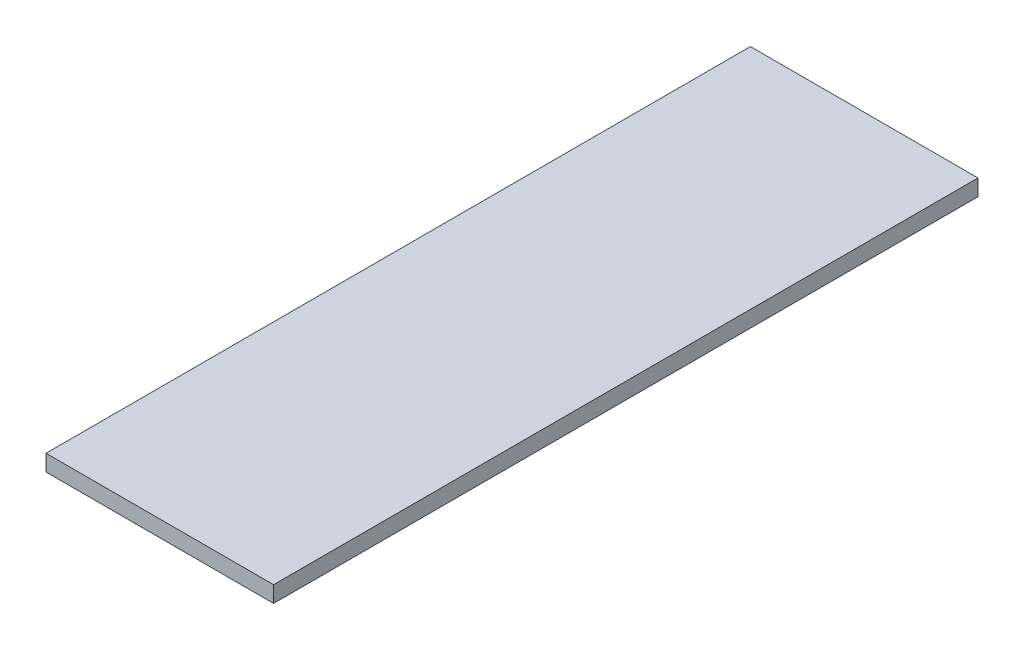
ISO-10303-21;
HEADER;
FILE_DESCRIPTION(('STEP AP214'),'2;1');
FILE_NAME('part.step','',(''),(''),'','','');
FILE_SCHEMA(('AUTOMOTIVE_DESIGN { 1 0 10303 214 1 1 1 1 }'));
ENDSEC;
DATA;
#1=APPLICATION_CONTEXT('core data for automotive mechanical design processes');
#2=APPLICATION_PROTOCOL_DEFINITION('international standard','automotive_design',2000,#1);
#3=PRODUCT_CONTEXT('',#1,'mechanical');
#4=PRODUCT('Part','Part','',(#3));
#5=PRODUCT_RELATED_PRODUCT_CATEGORY('part','',(#4));
#6=PRODUCT_DEFINITION_FORMATION('','',#4);
#7=PRODUCT_DEFINITION_CONTEXT('part definition',#1,'design');
#8=PRODUCT_DEFINITION('design','',#6,#7);
#9=PRODUCT_DEFINITION_SHAPE('','',#8);
#10=(LENGTH_UNIT() NAMED_UNIT(*) SI_UNIT(.MILLI.,.METRE.));
#11=(NAMED_UNIT(*) PLANE_ANGLE_UNIT() SI_UNIT($,.RADIAN.));
#12=(NAMED_UNIT(*) SI_UNIT($,.STERADIAN.) SOLID_ANGLE_UNIT());
#13=UNCERTAINTY_MEASURE_WITH_UNIT(LENGTH_MEASURE(1.E-05),#10,'distance_accuracy_value','');
#14=(GEOMETRIC_REPRESENTATION_CONTEXT(3) GLOBAL_UNCERTAINTY_ASSIGNED_CONTEXT((#13)) GLOBAL_UNIT_ASSIGNED_CONTEXT((#10,
#11,#12)) REPRESENTATION_CONTEXT('',''));
#15=CARTESIAN_POINT('',(0.,0.,0.));
#16=DIRECTION('',(0.,0.,1.));
#17=DIRECTION('',(1.,0.,0.));
#18=AXIS2_PLACEMENT_3D('',#15,#16,#17);
#19=CARTESIAN_POINT('',(10.5,1.5,32.5));
#20=DIRECTION('',(-1.,0.,0.));
#21=DIRECTION('',(0.,0.,1.));
#22=AXIS2_PLACEMENT_3D('',#19,#20,#21);
#23=PLANE('',#22);
#24=DIRECTION('',(0.,0.,-1.));
#25=VECTOR('',#24,1.);
#26=CARTESIAN_POINT('',(10.5,0.,32.5));
#27=LINE('',#26,#25);
#28=CARTESIAN_POINT('',(10.5,0.,32.5));
#29=VERTEX_POINT('',#28);
#30=CARTESIAN_POINT('',(10.5,0.,-32.5));
#31=VERTEX_POINT('',#30);
#32=EDGE_CURVE('E109',#29,#31,#27,.T.);
#33=ORIENTED_EDGE('',*,*,#32,.T.);
#34=DIRECTION('',(0.,-1.,0.));
#35=VECTOR('',#34,1.);
#36=CARTESIAN_POINT('',(10.5,1.5,-32.5));
#37=LINE('',#36,#35);
#38=CARTESIAN_POINT('',(10.5,1.5,-32.5));
#39=VERTEX_POINT('',#38);
#40=EDGE_CURVE('E11',#39,#31,#37,.T.);
#41=ORIENTED_EDGE('',*,*,#40,.F.);
#42=DIRECTION('',(0.,0.,-1.));
#43=VECTOR('',#42,1.);
#44=CARTESIAN_POINT('',(10.5,1.5,32.5));
#45=LINE('',#44,#43);
#46=CARTESIAN_POINT('',(10.5,1.5,32.5));
#47=VERTEX_POINT('',#46);
#48=EDGE_CURVE('E93',#47,#39,#45,.T.);
#49=ORIENTED_EDGE('',*,*,#48,.F.);
#50=DIRECTION('',(0.,-1.,0.));
#51=VECTOR('',#50,1.);
#52=CARTESIAN_POINT('',(10.5,1.5,32.5));
#53=LINE('',#52,#51);
#54=EDGE_CURVE('E105',#47,#29,#53,.T.);
#55=ORIENTED_EDGE('',*,*,#54,.T.);
#56=EDGE_LOOP('',(#33,#41,#49,#55));
#57=FACE_BOUND('',#56,.T.);
#58=ADVANCED_FACE('F41',(#57),#23,.F.);
#59=CARTESIAN_POINT('',(-10.5,1.5,-32.5));
#60=DIRECTION('',(0.,0.,1.));
#61=DIRECTION('',(1.,0.,0.));
#62=AXIS2_PLACEMENT_3D('',#59,#60,#61);
#63=PLANE('',#62);
#64=DIRECTION('',(-1.,0.,0.));
#65=VECTOR('',#64,1.);
#66=CARTESIAN_POINT('',(-10.5,0.,-32.5));
#67=LINE('',#66,#65);
#68=CARTESIAN_POINT('',(-10.5,0.,-32.5));
#69=VERTEX_POINT('',#68);
#70=EDGE_CURVE('E98',#31,#69,#67,.T.);
#71=ORIENTED_EDGE('',*,*,#70,.T.);
#72=DIRECTION('',(0.,-1.,0.));
#73=VECTOR('',#72,1.);
#74=CARTESIAN_POINT('',(-10.5,1.5,-32.5));
#75=LINE('',#74,#73);
#76=CARTESIAN_POINT('',(-10.5,1.5,-32.5));
#77=VERTEX_POINT('',#76);
#78=EDGE_CURVE('E50',#77,#69,#75,.T.);
#79=ORIENTED_EDGE('',*,*,#78,.F.);
#80=DIRECTION('',(-1.,0.,0.));
#81=VECTOR('',#80,1.);
#82=CARTESIAN_POINT('',(-10.5,1.5,-32.5));
#83=LINE('',#82,#81);
#84=EDGE_CURVE('E88',#39,#77,#83,.T.);
#85=ORIENTED_EDGE('',*,*,#84,.F.);
#86=ORIENTED_EDGE('',*,*,#40,.T.);
#87=EDGE_LOOP('',(#71,#79,#85,#86));
#88=FACE_BOUND('',#87,.T.);
#89=ADVANCED_FACE('F97',(#88),#63,.F.);
#90=CARTESIAN_POINT('',(-10.5,1.5,32.5));
#91=DIRECTION('',(1.,0.,0.));
#92=DIRECTION('',(0.,0.,-1.));
#93=AXIS2_PLACEMENT_3D('',#90,#91,#92);
#94=PLANE('',#93);
#95=DIRECTION('',(0.,0.,1.));
#96=VECTOR('',#95,1.);
#97=CARTESIAN_POINT('',(-10.5,0.,32.5));
#98=LINE('',#97,#96);
#99=CARTESIAN_POINT('',(-10.5,0.,32.5));
#100=VERTEX_POINT('',#99);
#101=EDGE_CURVE('E75',#69,#100,#98,.T.);
#102=ORIENTED_EDGE('',*,*,#101,.T.);
#103=DIRECTION('',(0.,-1.,0.));
#104=VECTOR('',#103,1.);
#105=CARTESIAN_POINT('',(-10.5,1.5,32.5));
#106=LINE('',#105,#104);
#107=CARTESIAN_POINT('',(-10.5,1.5,32.5));
#108=VERTEX_POINT('',#107);
#109=EDGE_CURVE('E100',#108,#100,#106,.T.);
#110=ORIENTED_EDGE('',*,*,#109,.F.);
#111=DIRECTION('',(0.,0.,1.));
#112=VECTOR('',#111,1.);
#113=CARTESIAN_POINT('',(-10.5,1.5,32.5));
#114=LINE('',#113,#112);
#115=EDGE_CURVE('E91',#77,#108,#114,.T.);
#116=ORIENTED_EDGE('',*,*,#115,.F.);
#117=ORIENTED_EDGE('',*,*,#78,.T.);
#118=EDGE_LOOP('',(#102,#110,#116,#117));
#119=FACE_BOUND('',#118,.T.);
#120=ADVANCED_FACE('F101',(#119),#94,.F.);
#121=CARTESIAN_POINT('',(-10.5,1.5,32.5));
#122=DIRECTION('',(0.,0.,-1.));
#123=DIRECTION('',(-1.,0.,0.));
#124=AXIS2_PLACEMENT_3D('',#121,#122,#123);
#125=PLANE('',#124);
#126=DIRECTION('',(1.,0.,0.));
#127=VECTOR('',#126,1.);
#128=CARTESIAN_POINT('',(-10.5,0.,32.5));
#129=LINE('',#128,#127);
#130=EDGE_CURVE('E81',#100,#29,#129,.T.);
#131=ORIENTED_EDGE('',*,*,#130,.T.);
#132=ORIENTED_EDGE('',*,*,#54,.F.);
#133=DIRECTION('',(1.,0.,0.));
#134=VECTOR('',#133,1.);
#135=CARTESIAN_POINT('',(-10.5,1.5,32.5));
#136=LINE('',#135,#134);
#137=EDGE_CURVE('E58',#108,#47,#136,.T.);
#138=ORIENTED_EDGE('',*,*,#137,.F.);
#139=ORIENTED_EDGE('',*,*,#109,.T.);
#140=EDGE_LOOP('',(#131,#132,#138,#139));
#141=FACE_BOUND('',#140,.T.);
#142=ADVANCED_FACE('F122',(#141),#125,.F.);
#143=CARTESIAN_POINT('',(0.,1.5,0.));
#144=DIRECTION('',(0.,-1.,0.));
#145=DIRECTION('',(0.,0.,-1.));
#146=AXIS2_PLACEMENT_3D('',#143,#144,#145);
#147=PLANE('',#146);
#148=ORIENTED_EDGE('',*,*,#48,.T.);
#149=ORIENTED_EDGE('',*,*,#84,.T.);
#150=ORIENTED_EDGE('',*,*,#115,.T.);
#151=ORIENTED_EDGE('',*,*,#137,.T.);
#152=EDGE_LOOP('',(#148,#149,#150,#151));
#153=FACE_BOUND('',#152,.T.);
#154=ADVANCED_FACE('F89',(#153),#147,.F.);
#155=CARTESIAN_POINT('',(0.,0.,0.));
#156=DIRECTION('',(0.,-1.,0.));
#157=DIRECTION('',(0.,0.,-1.));
#158=AXIS2_PLACEMENT_3D('',#155,#156,#157);
#159=PLANE('',#158);
#160=ORIENTED_EDGE('',*,*,#32,.F.);
#161=ORIENTED_EDGE('',*,*,#130,.F.);
#162=ORIENTED_EDGE('',*,*,#101,.F.);
#163=ORIENTED_EDGE('',*,*,#70,.F.);
#164=EDGE_LOOP('',(#160,#161,#162,#163));
#165=FACE_BOUND('',#164,.T.);
#166=ADVANCED_FACE('F125',(#165),#159,.T.);
#167=CLOSED_SHELL('',(#58,#89,#120,#142,#154,#166));
#168=MANIFOLD_SOLID_BREP('B2',#167);
#169=ADVANCED_BREP_SHAPE_REPRESENTATION('',(#18,#168),#14);
#170=SHAPE_DEFINITION_REPRESENTATION(#9,#169);
ENDSEC;
END-ISO-10303-21;
